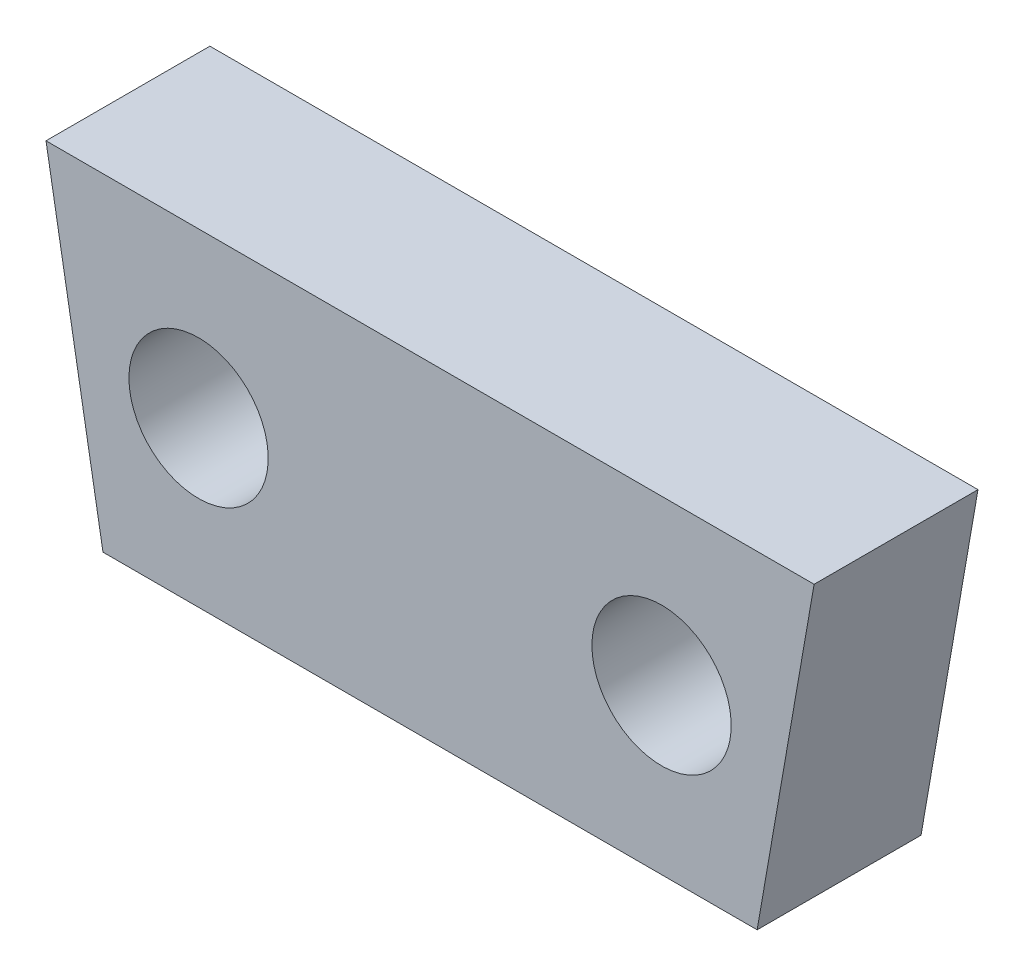
ISO-10303-21;
HEADER;
FILE_DESCRIPTION(('STEP AP214'),'2;1');
FILE_NAME('part.step','',(''),(''),'','','');
FILE_SCHEMA(('AUTOMOTIVE_DESIGN { 1 0 10303 214 1 1 1 1 }'));
ENDSEC;
DATA;
#1=APPLICATION_CONTEXT('core data for automotive mechanical design processes');
#2=APPLICATION_PROTOCOL_DEFINITION('international standard','automotive_design',2000,#1);
#3=PRODUCT_CONTEXT('',#1,'mechanical');
#4=PRODUCT('Part','Part','',(#3));
#5=PRODUCT_RELATED_PRODUCT_CATEGORY('part','',(#4));
#6=PRODUCT_DEFINITION_FORMATION('','',#4);
#7=PRODUCT_DEFINITION_CONTEXT('part definition',#1,'design');
#8=PRODUCT_DEFINITION('design','',#6,#7);
#9=PRODUCT_DEFINITION_SHAPE('','',#8);
#10=(LENGTH_UNIT() NAMED_UNIT(*) SI_UNIT(.MILLI.,.METRE.));
#11=(NAMED_UNIT(*) PLANE_ANGLE_UNIT() SI_UNIT($,.RADIAN.));
#12=(NAMED_UNIT(*) SI_UNIT($,.STERADIAN.) SOLID_ANGLE_UNIT());
#13=UNCERTAINTY_MEASURE_WITH_UNIT(LENGTH_MEASURE(1.E-05),#10,'distance_accuracy_value','');
#14=(GEOMETRIC_REPRESENTATION_CONTEXT(3) GLOBAL_UNCERTAINTY_ASSIGNED_CONTEXT((#13)) GLOBAL_UNIT_ASSIGNED_CONTEXT((#10,
#11,#12)) REPRESENTATION_CONTEXT('',''));
#15=CARTESIAN_POINT('',(0.,0.,0.));
#16=DIRECTION('',(0.,0.,1.));
#17=DIRECTION('',(1.,0.,0.));
#18=AXIS2_PLACEMENT_3D('',#15,#16,#17);
#19=CARTESIAN_POINT('',(-9.37362601085607,4.00000000000002,-4.));
#20=DIRECTION('',(0.985229325589676,0.171240112117785,0.));
#21=DIRECTION('',(-0.171240112117785,0.985229325589676,0.));
#22=AXIS2_PLACEMENT_3D('',#19,#20,#21);
#23=PLANE('',#22);
#24=DIRECTION('',(-0.171240112117785,0.985229325589676,0.));
#25=VECTOR('',#24,1.);
#26=CARTESIAN_POINT('',(-9.37362601085607,4.00000000000002,0.));
#27=LINE('',#26,#25);
#28=CARTESIAN_POINT('',(-7.98316709803152,-4.00000000000001,0.));
#29=VERTEX_POINT('',#28);
#30=CARTESIAN_POINT('',(-9.37362601085607,4.00000000000002,0.));
#31=VERTEX_POINT('',#30);
#32=EDGE_CURVE('E98',#29,#31,#27,.T.);
#33=ORIENTED_EDGE('',*,*,#32,.T.);
#34=DIRECTION('',(0.,0.,1.));
#35=VECTOR('',#34,1.);
#36=CARTESIAN_POINT('',(-9.37362601085607,4.00000000000002,-4.));
#37=LINE('',#36,#35);
#38=CARTESIAN_POINT('',(-9.37362601085607,4.00000000000002,-4.));
#39=VERTEX_POINT('',#38);
#40=EDGE_CURVE('E11',#39,#31,#37,.T.);
#41=ORIENTED_EDGE('',*,*,#40,.F.);
#42=DIRECTION('',(-0.171240112117785,0.985229325589676,0.));
#43=VECTOR('',#42,1.);
#44=CARTESIAN_POINT('',(-9.37362601085607,4.00000000000002,-4.));
#45=LINE('',#44,#43);
#46=CARTESIAN_POINT('',(-7.98316709803152,-4.00000000000001,-4.));
#47=VERTEX_POINT('',#46);
#48=EDGE_CURVE('E86',#47,#39,#45,.T.);
#49=ORIENTED_EDGE('',*,*,#48,.F.);
#50=DIRECTION('',(0.,0.,1.));
#51=VECTOR('',#50,1.);
#52=CARTESIAN_POINT('',(-7.98316709803152,-4.00000000000001,-4.));
#53=LINE('',#52,#51);
#54=EDGE_CURVE('E94',#47,#29,#53,.T.);
#55=ORIENTED_EDGE('',*,*,#54,.T.);
#56=EDGE_LOOP('',(#33,#41,#49,#55));
#57=FACE_BOUND('',#56,.T.);
#58=ADVANCED_FACE('F35',(#57),#23,.F.);
#59=CARTESIAN_POINT('',(-9.37362601085607,4.00000000000002,-4.));
#60=DIRECTION('',(0.,-1.,0.));
#61=DIRECTION('',(1.,0.,0.));
#62=AXIS2_PLACEMENT_3D('',#59,#60,#61);
#63=PLANE('',#62);
#64=DIRECTION('',(1.,0.,0.));
#65=VECTOR('',#64,1.);
#66=CARTESIAN_POINT('',(-9.37362601085607,4.00000000000002,0.));
#67=LINE('',#66,#65);
#68=CARTESIAN_POINT('',(9.37362601085601,3.99999999999974,0.));
#69=VERTEX_POINT('',#68);
#70=EDGE_CURVE('E90',#31,#69,#67,.T.);
#71=ORIENTED_EDGE('',*,*,#70,.T.);
#72=DIRECTION('',(0.,0.,1.));
#73=VECTOR('',#72,1.);
#74=CARTESIAN_POINT('',(9.37362601085601,3.99999999999974,-4.));
#75=LINE('',#74,#73);
#76=CARTESIAN_POINT('',(9.37362601085601,3.99999999999974,-4.));
#77=VERTEX_POINT('',#76);
#78=EDGE_CURVE('E43',#77,#69,#75,.T.);
#79=ORIENTED_EDGE('',*,*,#78,.F.);
#80=DIRECTION('',(1.,0.,0.));
#81=VECTOR('',#80,1.);
#82=CARTESIAN_POINT('',(-9.37362601085607,4.00000000000002,-4.));
#83=LINE('',#82,#81);
#84=EDGE_CURVE('E81',#39,#77,#83,.T.);
#85=ORIENTED_EDGE('',*,*,#84,.F.);
#86=ORIENTED_EDGE('',*,*,#40,.T.);
#87=EDGE_LOOP('',(#71,#79,#85,#86));
#88=FACE_BOUND('',#87,.T.);
#89=ADVANCED_FACE('F89',(#88),#63,.F.);
#90=CARTESIAN_POINT('',(9.37362601085601,3.99999999999974,-4.));
#91=DIRECTION('',(-0.985229325589677,0.171240112117784,0.));
#92=DIRECTION('',(-0.171240112117784,-0.985229325589677,0.));
#93=AXIS2_PLACEMENT_3D('',#90,#91,#92);
#94=PLANE('',#93);
#95=DIRECTION('',(-0.171240112117784,-0.985229325589676,0.));
#96=VECTOR('',#95,1.);
#97=CARTESIAN_POINT('',(9.37362601085601,3.99999999999974,0.));
#98=LINE('',#97,#96);
#99=CARTESIAN_POINT('',(7.98316709803152,-4.00000000000001,0.));
#100=VERTEX_POINT('',#99);
#101=EDGE_CURVE('E68',#69,#100,#98,.T.);
#102=ORIENTED_EDGE('',*,*,#101,.T.);
#103=DIRECTION('',(0.,0.,1.));
#104=VECTOR('',#103,1.);
#105=CARTESIAN_POINT('',(7.98316709803152,-4.00000000000001,-4.));
#106=LINE('',#105,#104);
#107=CARTESIAN_POINT('',(7.98316709803152,-4.00000000000001,-4.));
#108=VERTEX_POINT('',#107);
#109=EDGE_CURVE('E91',#108,#100,#106,.T.);
#110=ORIENTED_EDGE('',*,*,#109,.F.);
#111=DIRECTION('',(-0.171240112117784,-0.985229325589676,0.));
#112=VECTOR('',#111,1.);
#113=CARTESIAN_POINT('',(9.37362601085601,3.99999999999974,-4.));
#114=LINE('',#113,#112);
#115=EDGE_CURVE('E84',#77,#108,#114,.T.);
#116=ORIENTED_EDGE('',*,*,#115,.F.);
#117=ORIENTED_EDGE('',*,*,#78,.T.);
#118=EDGE_LOOP('',(#102,#110,#116,#117));
#119=FACE_BOUND('',#118,.T.);
#120=ADVANCED_FACE('F92',(#119),#94,.F.);
#121=CARTESIAN_POINT('',(7.98316709803152,-4.00000000000001,-4.));
#122=DIRECTION('',(0.,1.,0.));
#123=DIRECTION('',(0.,0.,1.));
#124=AXIS2_PLACEMENT_3D('',#121,#122,#123);
#125=PLANE('',#124);
#126=DIRECTION('',(-1.,0.,0.));
#127=VECTOR('',#126,1.);
#128=CARTESIAN_POINT('',(7.98316709803152,-4.00000000000001,0.));
#129=LINE('',#128,#127);
#130=EDGE_CURVE('E74',#100,#29,#129,.T.);
#131=ORIENTED_EDGE('',*,*,#130,.T.);
#132=ORIENTED_EDGE('',*,*,#54,.F.);
#133=DIRECTION('',(-1.,0.,0.));
#134=VECTOR('',#133,1.);
#135=CARTESIAN_POINT('',(7.98316709803152,-4.00000000000001,-4.));
#136=LINE('',#135,#134);
#137=EDGE_CURVE('E51',#108,#47,#136,.T.);
#138=ORIENTED_EDGE('',*,*,#137,.F.);
#139=ORIENTED_EDGE('',*,*,#109,.T.);
#140=EDGE_LOOP('',(#131,#132,#138,#139));
#141=FACE_BOUND('',#140,.T.);
#142=ADVANCED_FACE('F106',(#141),#125,.F.);
#143=CARTESIAN_POINT('',(0.,0.,-4.));
#144=DIRECTION('',(0.,0.,-1.));
#145=DIRECTION('',(-1.,0.,0.));
#146=AXIS2_PLACEMENT_3D('',#143,#144,#145);
#147=PLANE('',#146);
#148=CARTESIAN_POINT('',(5.65,2.51534904016637E-13,-4.));
#149=DIRECTION('',(0.,0.,-1.));
#150=DIRECTION('',(-1.,0.,0.));
#151=AXIS2_PLACEMENT_3D('',#148,#149,#150);
#152=CIRCLE('',#151,1.69999999999999);
#153=CARTESIAN_POINT('',(3.95000000000001,2.51534904016637E-13,-4.));
#154=VERTEX_POINT('',#153);
#155=EDGE_CURVE('E120',#154,#154,#152,.T.);
#156=ORIENTED_EDGE('',*,*,#155,.F.);
#157=EDGE_LOOP('',(#156));
#158=FACE_BOUND('',#157,.T.);
#159=CARTESIAN_POINT('',(-5.65,2.53269627492614E-13,-4.));
#160=DIRECTION('',(0.,0.,-1.));
#161=DIRECTION('',(-1.,0.,0.));
#162=AXIS2_PLACEMENT_3D('',#159,#160,#161);
#163=CIRCLE('',#162,1.69999999999999);
#164=CARTESIAN_POINT('',(-7.34999999999999,2.53269627492614E-13,-4.));
#165=VERTEX_POINT('',#164);
#166=EDGE_CURVE('E114',#165,#165,#163,.T.);
#167=ORIENTED_EDGE('',*,*,#166,.F.);
#168=EDGE_LOOP('',(#167));
#169=FACE_BOUND('',#168,.T.);
#170=ORIENTED_EDGE('',*,*,#48,.T.);
#171=ORIENTED_EDGE('',*,*,#84,.T.);
#172=ORIENTED_EDGE('',*,*,#115,.T.);
#173=ORIENTED_EDGE('',*,*,#137,.T.);
#174=EDGE_LOOP('',(#170,#171,#172,#173));
#175=FACE_BOUND('',#174,.T.);
#176=ADVANCED_FACE('F82',(#158,#169,#175),#147,.T.);
#177=CARTESIAN_POINT('',(0.,0.,0.));
#178=DIRECTION('',(0.,0.,-1.));
#179=DIRECTION('',(-1.,0.,0.));
#180=AXIS2_PLACEMENT_3D('',#177,#178,#179);
#181=PLANE('',#180);
#182=CARTESIAN_POINT('',(5.65,2.51534904016637E-13,0.));
#183=DIRECTION('',(0.,0.,-1.));
#184=DIRECTION('',(-1.,0.,0.));
#185=AXIS2_PLACEMENT_3D('',#182,#183,#184);
#186=CIRCLE('',#185,1.7);
#187=CARTESIAN_POINT('',(3.95,2.51534904016637E-13,0.));
#188=VERTEX_POINT('',#187);
#189=EDGE_CURVE('E117',#188,#188,#186,.T.);
#190=ORIENTED_EDGE('',*,*,#189,.T.);
#191=EDGE_LOOP('',(#190));
#192=FACE_BOUND('',#191,.T.);
#193=CARTESIAN_POINT('',(-5.65,2.53269627492614E-13,0.));
#194=DIRECTION('',(0.,0.,-1.));
#195=DIRECTION('',(-1.,0.,0.));
#196=AXIS2_PLACEMENT_3D('',#193,#194,#195);
#197=CIRCLE('',#196,1.7);
#198=CARTESIAN_POINT('',(-7.35,2.53269627492614E-13,0.));
#199=VERTEX_POINT('',#198);
#200=EDGE_CURVE('E101',#199,#199,#197,.T.);
#201=ORIENTED_EDGE('',*,*,#200,.T.);
#202=EDGE_LOOP('',(#201));
#203=FACE_BOUND('',#202,.T.);
#204=ORIENTED_EDGE('',*,*,#32,.F.);
#205=ORIENTED_EDGE('',*,*,#130,.F.);
#206=ORIENTED_EDGE('',*,*,#101,.F.);
#207=ORIENTED_EDGE('',*,*,#70,.F.);
#208=EDGE_LOOP('',(#204,#205,#206,#207));
#209=FACE_BOUND('',#208,.T.);
#210=ADVANCED_FACE('F109',(#192,#203,#209),#181,.F.);
#211=CARTESIAN_POINT('',(-5.65,2.53269627492614E-13,-4.));
#212=DIRECTION('',(0.,0.,-1.));
#213=DIRECTION('',(-1.,0.,0.));
#214=AXIS2_PLACEMENT_3D('',#211,#212,#213);
#215=CYLINDRICAL_SURFACE('',#214,1.69999999999999);
#216=ORIENTED_EDGE('',*,*,#200,.F.);
#217=EDGE_LOOP('',(#216));
#218=FACE_BOUND('',#217,.T.);
#219=ORIENTED_EDGE('',*,*,#166,.T.);
#220=EDGE_LOOP('',(#219));
#221=FACE_BOUND('',#220,.T.);
#222=ADVANCED_FACE('F131',(#218,#221),#215,.F.);
#223=CARTESIAN_POINT('',(5.65,2.51534904016637E-13,-4.));
#224=DIRECTION('',(0.,0.,-1.));
#225=DIRECTION('',(-1.,0.,0.));
#226=AXIS2_PLACEMENT_3D('',#223,#224,#225);
#227=CYLINDRICAL_SURFACE('',#226,1.69999999999999);
#228=ORIENTED_EDGE('',*,*,#189,.F.);
#229=EDGE_LOOP('',(#228));
#230=FACE_BOUND('',#229,.T.);
#231=ORIENTED_EDGE('',*,*,#155,.T.);
#232=EDGE_LOOP('',(#231));
#233=FACE_BOUND('',#232,.T.);
#234=ADVANCED_FACE('F124',(#230,#233),#227,.F.);
#235=CLOSED_SHELL('',(#58,#89,#120,#142,#176,#210,#222,#234));
#236=MANIFOLD_SOLID_BREP('B2',#235);
#237=ADVANCED_BREP_SHAPE_REPRESENTATION('',(#18,#236),#14);
#238=SHAPE_DEFINITION_REPRESENTATION(#9,#237);
ENDSEC;
END-ISO-10303-21;
